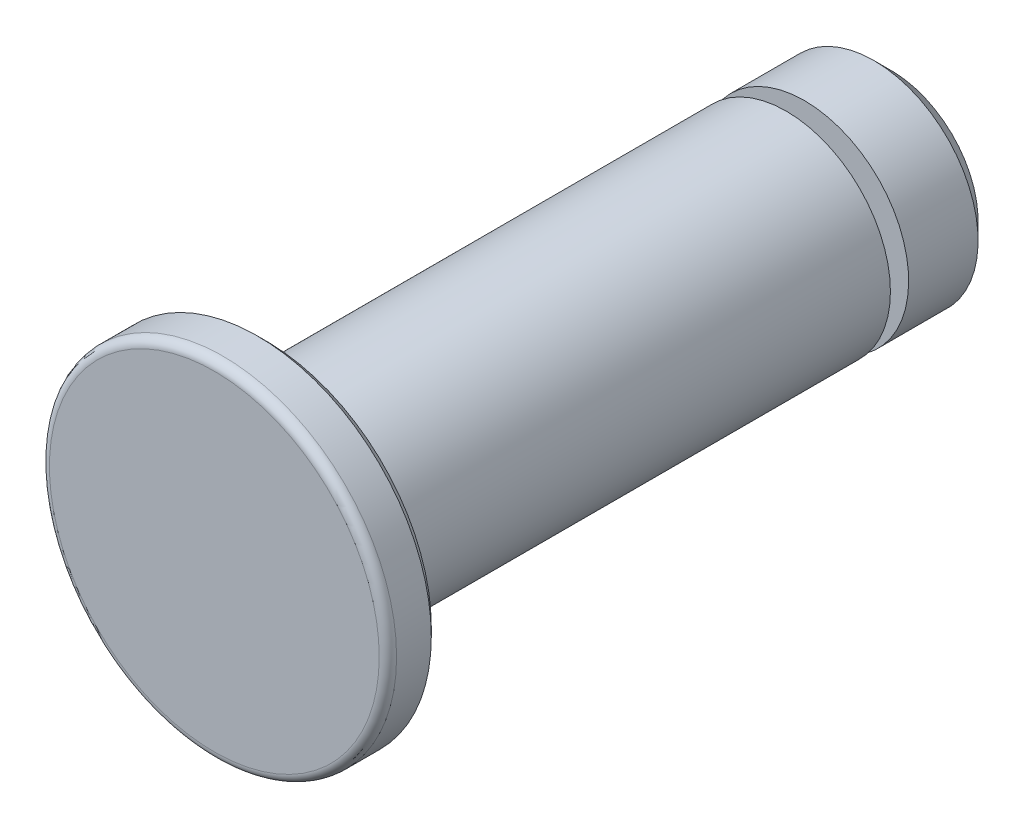
ISO-10303-21;
HEADER;
FILE_DESCRIPTION(('STEP AP214'),'2;1');
FILE_NAME('part.step','',(''),(''),'','','');
FILE_SCHEMA(('AUTOMOTIVE_DESIGN { 1 0 10303 214 1 1 1 1 }'));
ENDSEC;
DATA;
#1=APPLICATION_CONTEXT('core data for automotive mechanical design processes');
#2=APPLICATION_PROTOCOL_DEFINITION('international standard','automotive_design',2000,#1);
#3=PRODUCT_CONTEXT('',#1,'mechanical');
#4=PRODUCT('Part','Part','',(#3));
#5=PRODUCT_RELATED_PRODUCT_CATEGORY('part','',(#4));
#6=PRODUCT_DEFINITION_FORMATION('','',#4);
#7=PRODUCT_DEFINITION_CONTEXT('part definition',#1,'design');
#8=PRODUCT_DEFINITION('design','',#6,#7);
#9=PRODUCT_DEFINITION_SHAPE('','',#8);
#10=(LENGTH_UNIT() NAMED_UNIT(*) SI_UNIT(.MILLI.,.METRE.));
#11=(NAMED_UNIT(*) PLANE_ANGLE_UNIT() SI_UNIT($,.RADIAN.));
#12=(NAMED_UNIT(*) SI_UNIT($,.STERADIAN.) SOLID_ANGLE_UNIT());
#13=UNCERTAINTY_MEASURE_WITH_UNIT(LENGTH_MEASURE(1.E-05),#10,'distance_accuracy_value','');
#14=(GEOMETRIC_REPRESENTATION_CONTEXT(3) GLOBAL_UNCERTAINTY_ASSIGNED_CONTEXT((#13)) GLOBAL_UNIT_ASSIGNED_CONTEXT((#10,
#11,#12)) REPRESENTATION_CONTEXT('',''));
#15=CARTESIAN_POINT('',(0.,0.,0.));
#16=DIRECTION('',(0.,0.,1.));
#17=DIRECTION('',(1.,0.,0.));
#18=AXIS2_PLACEMENT_3D('',#15,#16,#17);
#19=CARTESIAN_POINT('',(0.,0.,3.));
#20=DIRECTION('',(0.,0.,-1.));
#21=DIRECTION('',(-1.,0.,0.));
#22=AXIS2_PLACEMENT_3D('',#19,#20,#21);
#23=CYLINDRICAL_SURFACE('',#22,10.);
#24=CARTESIAN_POINT('',(0.,0.,0.499999999999988));
#25=DIRECTION('',(0.,0.,1.));
#26=DIRECTION('',(1.,0.,0.));
#27=AXIS2_PLACEMENT_3D('',#24,#25,#26);
#28=CIRCLE('',#27,10.);
#29=CARTESIAN_POINT('',(10.,0.,0.499999999999988));
#30=VERTEX_POINT('',#29);
#31=EDGE_CURVE('E65',#30,#30,#28,.T.);
#32=ORIENTED_EDGE('',*,*,#31,.T.);
#33=EDGE_LOOP('',(#32));
#34=FACE_BOUND('',#33,.T.);
#35=CARTESIAN_POINT('',(0.,0.,2.5));
#36=DIRECTION('',(0.,0.,1.));
#37=DIRECTION('',(1.,0.,0.));
#38=AXIS2_PLACEMENT_3D('',#35,#36,#37);
#39=CIRCLE('',#38,10.);
#40=CARTESIAN_POINT('',(10.,0.,2.5));
#41=VERTEX_POINT('',#40);
#42=EDGE_CURVE('E69',#41,#41,#39,.F.);
#43=ORIENTED_EDGE('',*,*,#42,.T.);
#44=EDGE_LOOP('',(#43));
#45=FACE_BOUND('',#44,.T.);
#46=ADVANCED_FACE('F37',(#34,#45),#23,.T.);
#47=CARTESIAN_POINT('',(0.,0.,3.));
#48=DIRECTION('',(0.,0.,1.));
#49=DIRECTION('',(1.,0.,0.));
#50=AXIS2_PLACEMENT_3D('',#47,#48,#49);
#51=PLANE('',#50);
#52=CARTESIAN_POINT('',(0.,0.,3.));
#53=DIRECTION('',(0.,0.,1.));
#54=DIRECTION('',(1.,0.,0.));
#55=AXIS2_PLACEMENT_3D('',#52,#53,#54);
#56=CIRCLE('',#55,9.5);
#57=CARTESIAN_POINT('',(9.5,0.,3.));
#58=VERTEX_POINT('',#57);
#59=EDGE_CURVE('E73',#58,#58,#56,.T.);
#60=ORIENTED_EDGE('',*,*,#59,.T.);
#61=EDGE_LOOP('',(#60));
#62=FACE_BOUND('',#61,.T.);
#63=ADVANCED_FACE('F131',(#62),#51,.T.);
#64=CARTESIAN_POINT('',(0.,0.,0.));
#65=DIRECTION('',(0.,0.,1.));
#66=DIRECTION('',(1.,0.,0.));
#67=AXIS2_PLACEMENT_3D('',#64,#65,#66);
#68=PLANE('',#67);
#69=CARTESIAN_POINT('',(0.,0.,0.));
#70=DIRECTION('',(0.,0.,1.));
#71=DIRECTION('',(1.,0.,0.));
#72=AXIS2_PLACEMENT_3D('',#69,#70,#71);
#73=CIRCLE('',#72,9.50000000000001);
#74=CARTESIAN_POINT('',(9.50000000000001,0.,0.));
#75=VERTEX_POINT('',#74);
#76=EDGE_CURVE('E55',#75,#75,#73,.F.);
#77=ORIENTED_EDGE('',*,*,#76,.T.);
#78=EDGE_LOOP('',(#77));
#79=FACE_BOUND('',#78,.T.);
#80=CARTESIAN_POINT('',(0.,0.,0.));
#81=DIRECTION('',(0.,0.,1.));
#82=DIRECTION('',(1.,0.,0.));
#83=AXIS2_PLACEMENT_3D('',#80,#81,#82);
#84=CIRCLE('',#83,6.49999999999999);
#85=CARTESIAN_POINT('',(6.49999999999999,0.,0.));
#86=VERTEX_POINT('',#85);
#87=EDGE_CURVE('E61',#86,#86,#84,.T.);
#88=ORIENTED_EDGE('',*,*,#87,.T.);
#89=EDGE_LOOP('',(#88));
#90=FACE_BOUND('',#89,.T.);
#91=ADVANCED_FACE('F137',(#79,#90),#68,.F.);
#92=CARTESIAN_POINT('',(0.,0.,2.5));
#93=DIRECTION('',(0.,0.,1.));
#94=DIRECTION('',(1.,0.,0.));
#95=AXIS2_PLACEMENT_3D('',#92,#93,#94);
#96=TOROIDAL_SURFACE('',#95,9.5,0.5);
#97=ORIENTED_EDGE('',*,*,#42,.F.);
#98=EDGE_LOOP('',(#97));
#99=FACE_BOUND('',#98,.T.);
#100=ORIENTED_EDGE('',*,*,#59,.F.);
#101=EDGE_LOOP('',(#100));
#102=FACE_BOUND('',#101,.T.);
#103=ADVANCED_FACE('F114',(#99,#102),#96,.T.);
#104=CARTESIAN_POINT('',(0.,0.,-31.));
#105=DIRECTION('',(0.,0.,1.));
#106=DIRECTION('',(1.,0.,0.));
#107=AXIS2_PLACEMENT_3D('',#104,#105,#106);
#108=CYLINDRICAL_SURFACE('',#107,6.);
#109=CARTESIAN_POINT('',(0.,0.,-29.95));
#110=DIRECTION('',(0.,0.,-1.));
#111=DIRECTION('',(0.,1.,0.));
#112=AXIS2_PLACEMENT_3D('',#109,#110,#111);
#113=CIRCLE('',#112,6.);
#114=CARTESIAN_POINT('',(0.,6.,-29.95));
#115=VERTEX_POINT('',#114);
#116=EDGE_CURVE('E81',#115,#115,#113,.T.);
#117=ORIENTED_EDGE('',*,*,#116,.F.);
#118=EDGE_LOOP('',(#117));
#119=FACE_BOUND('',#118,.T.);
#120=CARTESIAN_POINT('',(0.,0.,-0.5));
#121=DIRECTION('',(0.,0.,1.));
#122=DIRECTION('',(1.,0.,0.));
#123=AXIS2_PLACEMENT_3D('',#120,#121,#122);
#124=CIRCLE('',#123,6.);
#125=CARTESIAN_POINT('',(6.,0.,-0.5));
#126=VERTEX_POINT('',#125);
#127=EDGE_CURVE('E50',#126,#126,#124,.F.);
#128=ORIENTED_EDGE('',*,*,#127,.T.);
#129=EDGE_LOOP('',(#128));
#130=FACE_BOUND('',#129,.T.);
#131=ADVANCED_FACE('F110',(#119,#130),#108,.T.);
#132=CARTESIAN_POINT('',(0.,0.,0.499999999999988));
#133=DIRECTION('',(0.,0.,1.));
#134=DIRECTION('',(1.,0.,0.));
#135=AXIS2_PLACEMENT_3D('',#132,#133,#134);
#136=CONICAL_SURFACE('',#135,10.,0.785398163397455);
#137=ORIENTED_EDGE('',*,*,#76,.F.);
#138=EDGE_LOOP('',(#137));
#139=FACE_BOUND('',#138,.T.);
#140=ORIENTED_EDGE('',*,*,#31,.F.);
#141=EDGE_LOOP('',(#140));
#142=FACE_BOUND('',#141,.T.);
#143=ADVANCED_FACE('F113',(#139,#142),#136,.T.);
#144=CARTESIAN_POINT('',(0.,0.,-0.5));
#145=DIRECTION('',(0.,0.,1.));
#146=DIRECTION('',(1.,0.,0.));
#147=AXIS2_PLACEMENT_3D('',#144,#145,#146);
#148=CONICAL_SURFACE('',#147,6.,0.785398163397439);
#149=ORIENTED_EDGE('',*,*,#87,.F.);
#150=EDGE_LOOP('',(#149));
#151=FACE_BOUND('',#150,.T.);
#152=ORIENTED_EDGE('',*,*,#127,.F.);
#153=EDGE_LOOP('',(#152));
#154=FACE_BOUND('',#153,.T.);
#155=ADVANCED_FACE('F119',(#151,#154),#148,.T.);
#156=CARTESIAN_POINT('',(0.,0.,-31.));
#157=DIRECTION('',(0.,0.,1.));
#158=DIRECTION('',(0.,-1.,0.));
#159=AXIS2_PLACEMENT_3D('',#156,#157,#158);
#160=PLANE('',#159);
#161=CARTESIAN_POINT('',(0.,0.,-31.));
#162=DIRECTION('',(0.,0.,-1.));
#163=DIRECTION('',(0.,1.,0.));
#164=AXIS2_PLACEMENT_3D('',#161,#162,#163);
#165=CIRCLE('',#164,4.);
#166=CARTESIAN_POINT('',(0.,4.,-31.));
#167=VERTEX_POINT('',#166);
#168=EDGE_CURVE('E89',#167,#167,#165,.T.);
#169=ORIENTED_EDGE('',*,*,#168,.T.);
#170=EDGE_LOOP('',(#169));
#171=FACE_BOUND('',#170,.T.);
#172=CARTESIAN_POINT('',(0.,0.,-31.));
#173=DIRECTION('',(0.,0.,-1.));
#174=DIRECTION('',(0.,1.,0.));
#175=AXIS2_PLACEMENT_3D('',#172,#173,#174);
#176=CIRCLE('',#175,6.);
#177=CARTESIAN_POINT('',(0.,6.,-31.));
#178=VERTEX_POINT('',#177);
#179=EDGE_CURVE('E77',#178,#178,#176,.T.);
#180=ORIENTED_EDGE('',*,*,#179,.F.);
#181=EDGE_LOOP('',(#180));
#182=FACE_BOUND('',#181,.T.);
#183=ADVANCED_FACE('F94',(#171,#182),#160,.T.);
#184=CARTESIAN_POINT('',(0.,0.,-29.95));
#185=DIRECTION('',(0.,0.,1.));
#186=DIRECTION('',(0.,-1.,0.));
#187=AXIS2_PLACEMENT_3D('',#184,#185,#186);
#188=PLANE('',#187);
#189=CARTESIAN_POINT('',(0.,0.,-29.95));
#190=DIRECTION('',(0.,0.,-1.));
#191=DIRECTION('',(0.,1.,0.));
#192=AXIS2_PLACEMENT_3D('',#189,#190,#191);
#193=CIRCLE('',#192,4.);
#194=CARTESIAN_POINT('',(0.,4.,-29.95));
#195=VERTEX_POINT('',#194);
#196=EDGE_CURVE('E85',#195,#195,#193,.T.);
#197=ORIENTED_EDGE('',*,*,#196,.F.);
#198=EDGE_LOOP('',(#197));
#199=FACE_BOUND('',#198,.T.);
#200=ORIENTED_EDGE('',*,*,#116,.T.);
#201=EDGE_LOOP('',(#200));
#202=FACE_BOUND('',#201,.T.);
#203=ADVANCED_FACE('F101',(#199,#202),#188,.F.);
#204=CARTESIAN_POINT('',(0.,0.,-36.));
#205=DIRECTION('',(0.,0.,-1.));
#206=DIRECTION('',(0.,1.,0.));
#207=AXIS2_PLACEMENT_3D('',#204,#205,#206);
#208=CYLINDRICAL_SURFACE('',#207,4.);
#209=ORIENTED_EDGE('',*,*,#168,.F.);
#210=EDGE_LOOP('',(#209));
#211=FACE_BOUND('',#210,.T.);
#212=ORIENTED_EDGE('',*,*,#196,.T.);
#213=EDGE_LOOP('',(#212));
#214=FACE_BOUND('',#213,.T.);
#215=ADVANCED_FACE('F97',(#211,#214),#208,.T.);
#216=CARTESIAN_POINT('',(0.,0.,-36.));
#217=DIRECTION('',(0.,0.,-1.));
#218=DIRECTION('',(-1.,0.,0.));
#219=AXIS2_PLACEMENT_3D('',#216,#217,#218);
#220=PLANE('',#219);
#221=CARTESIAN_POINT('',(0.,0.,-36.));
#222=DIRECTION('',(0.,0.,-1.));
#223=DIRECTION('',(-1.,0.,0.));
#224=AXIS2_PLACEMENT_3D('',#221,#222,#223);
#225=CIRCLE('',#224,5.);
#226=CARTESIAN_POINT('',(-5.,0.,-36.));
#227=VERTEX_POINT('',#226);
#228=EDGE_CURVE('E45',#227,#227,#225,.T.);
#229=ORIENTED_EDGE('',*,*,#228,.T.);
#230=EDGE_LOOP('',(#229));
#231=FACE_BOUND('',#230,.T.);
#232=ADVANCED_FACE('F100',(#231),#220,.T.);
#233=CARTESIAN_POINT('',(0.,0.,-35.));
#234=DIRECTION('',(0.,0.,-1.));
#235=DIRECTION('',(-1.,0.,0.));
#236=AXIS2_PLACEMENT_3D('',#233,#234,#235);
#237=CIRCLE('',#236,6.);
#238=CARTESIAN_POINT('',(-6.,0.,-35.));
#239=VERTEX_POINT('',#238);
#240=EDGE_CURVE('E10',#239,#239,#237,.F.);
#241=ORIENTED_EDGE('',*,*,#240,.T.);
#242=EDGE_LOOP('',(#241));
#243=FACE_BOUND('',#242,.T.);
#244=ORIENTED_EDGE('',*,*,#179,.T.);
#245=EDGE_LOOP('',(#244));
#246=FACE_BOUND('',#245,.T.);
#247=ADVANCED_FACE('F116',(#243,#246),#108,.T.);
#248=CARTESIAN_POINT('',(0.,0.,-36.));
#249=DIRECTION('',(0.,0.,1.));
#250=DIRECTION('',(1.,0.,0.));
#251=AXIS2_PLACEMENT_3D('',#248,#249,#250);
#252=CONICAL_SURFACE('',#251,5.,0.78539816339745);
#253=ORIENTED_EDGE('',*,*,#240,.F.);
#254=EDGE_LOOP('',(#253));
#255=FACE_BOUND('',#254,.T.);
#256=ORIENTED_EDGE('',*,*,#228,.F.);
#257=EDGE_LOOP('',(#256));
#258=FACE_BOUND('',#257,.T.);
#259=ADVANCED_FACE('F39',(#255,#258),#252,.T.);
#260=CLOSED_SHELL('',(#46,#63,#91,#103,#131,#143,#155,#183,#203,#215,#232,#247,#259));
#261=MANIFOLD_SOLID_BREP('B2',#260);
#262=ADVANCED_BREP_SHAPE_REPRESENTATION('',(#18,#261),#14);
#263=SHAPE_DEFINITION_REPRESENTATION(#9,#262);
ENDSEC;
END-ISO-10303-21;
